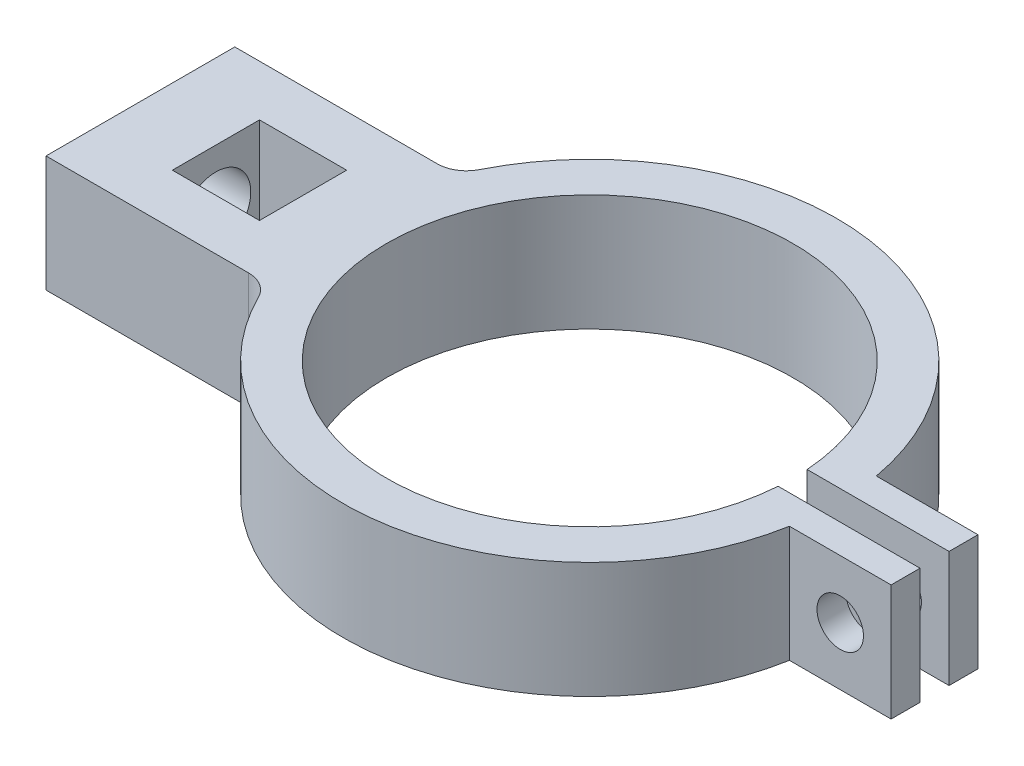
ISO-10303-21;
HEADER;
FILE_DESCRIPTION(('STEP AP214'),'2;1');
FILE_NAME('part.step','',(''),(''),'','','');
FILE_SCHEMA(('AUTOMOTIVE_DESIGN { 1 0 10303 214 1 1 1 1 }'));
ENDSEC;
DATA;
#1=APPLICATION_CONTEXT('core data for automotive mechanical design processes');
#2=APPLICATION_PROTOCOL_DEFINITION('international standard','automotive_design',2000,#1);
#3=PRODUCT_CONTEXT('',#1,'mechanical');
#4=PRODUCT('Part','Part','',(#3));
#5=PRODUCT_RELATED_PRODUCT_CATEGORY('part','',(#4));
#6=PRODUCT_DEFINITION_FORMATION('','',#4);
#7=PRODUCT_DEFINITION_CONTEXT('part definition',#1,'design');
#8=PRODUCT_DEFINITION('design','',#6,#7);
#9=PRODUCT_DEFINITION_SHAPE('','',#8);
#10=(LENGTH_UNIT() NAMED_UNIT(*) SI_UNIT(.MILLI.,.METRE.));
#11=(NAMED_UNIT(*) PLANE_ANGLE_UNIT() SI_UNIT($,.RADIAN.));
#12=(NAMED_UNIT(*) SI_UNIT($,.STERADIAN.) SOLID_ANGLE_UNIT());
#13=UNCERTAINTY_MEASURE_WITH_UNIT(LENGTH_MEASURE(1.E-05),#10,'distance_accuracy_value','');
#14=(GEOMETRIC_REPRESENTATION_CONTEXT(3) GLOBAL_UNCERTAINTY_ASSIGNED_CONTEXT((#13)) GLOBAL_UNIT_ASSIGNED_CONTEXT((#10,
#11,#12)) REPRESENTATION_CONTEXT('',''));
#15=CARTESIAN_POINT('',(0.,0.,0.));
#16=DIRECTION('',(0.,0.,1.));
#17=DIRECTION('',(1.,0.,0.));
#18=AXIS2_PLACEMENT_3D('',#15,#16,#17);
#19=CARTESIAN_POINT('',(0.,10.16,0.));
#20=DIRECTION('',(0.,1.,0.));
#21=DIRECTION('',(0.,0.,1.));
#22=AXIS2_PLACEMENT_3D('',#19,#20,#21);
#23=PLANE('',#22);
#24=CARTESIAN_POINT('',(0.,10.16,0.));
#25=DIRECTION('',(0.,1.,0.));
#26=DIRECTION('',(0.,0.,1.));
#27=AXIS2_PLACEMENT_3D('',#24,#25,#26);
#28=CIRCLE('',#27,21.59);
#29=CARTESIAN_POINT('',(21.251230572981,10.16,-3.8096324145508));
#30=VERTEX_POINT('',#29);
#31=CARTESIAN_POINT('',(-19.3090113501787,10.16,-9.65868421052631));
#32=VERTEX_POINT('',#31);
#33=EDGE_CURVE('E227',#30,#32,#28,.T.);
#34=ORIENTED_EDGE('',*,*,#33,.T.);
#35=CARTESIAN_POINT('',(-21.5806597443174,10.16,-10.795));
#36=DIRECTION('',(0.,1.,0.));
#37=DIRECTION('',(0.,0.,1.));
#38=AXIS2_PLACEMENT_3D('',#35,#36,#37);
#39=CIRCLE('',#38,2.54);
#40=CARTESIAN_POINT('',(-21.5806597443174,10.16,-8.255));
#41=VERTEX_POINT('',#40);
#42=EDGE_CURVE('E294',#32,#41,#39,.F.);
#43=ORIENTED_EDGE('',*,*,#42,.T.);
#44=DIRECTION('',(-1.,0.,0.));
#45=VECTOR('',#44,1.);
#46=CARTESIAN_POINT('',(-19.9495131519544,10.16,-8.255));
#47=LINE('',#46,#45);
#48=CARTESIAN_POINT('',(-39.2920360483371,10.16,-8.255));
#49=VERTEX_POINT('',#48);
#50=EDGE_CURVE('E204',#41,#49,#47,.T.);
#51=ORIENTED_EDGE('',*,*,#50,.T.);
#52=DIRECTION('',(0.,0.,1.));
#53=VECTOR('',#52,1.);
#54=CARTESIAN_POINT('',(-39.2920360483371,10.16,-8.255));
#55=LINE('',#54,#53);
#56=CARTESIAN_POINT('',(-39.2920360483371,10.16,8.255));
#57=VERTEX_POINT('',#56);
#58=EDGE_CURVE('E206',#49,#57,#55,.T.);
#59=ORIENTED_EDGE('',*,*,#58,.T.);
#60=DIRECTION('',(1.,0.,0.));
#61=VECTOR('',#60,1.);
#62=CARTESIAN_POINT('',(-19.9495131519544,10.16,8.255));
#63=LINE('',#62,#61);
#64=CARTESIAN_POINT('',(-21.5806597443174,10.16,8.255));
#65=VERTEX_POINT('',#64);
#66=EDGE_CURVE('E209',#57,#65,#63,.T.);
#67=ORIENTED_EDGE('',*,*,#66,.T.);
#68=CARTESIAN_POINT('',(-21.5806597443174,10.16,10.795));
#69=DIRECTION('',(0.,1.,0.));
#70=DIRECTION('',(0.,0.,1.));
#71=AXIS2_PLACEMENT_3D('',#68,#69,#70);
#72=CIRCLE('',#71,2.54);
#73=CARTESIAN_POINT('',(-19.3090113501787,10.16,9.65868421052632));
#74=VERTEX_POINT('',#73);
#75=EDGE_CURVE('E11',#65,#74,#72,.F.);
#76=ORIENTED_EDGE('',*,*,#75,.T.);
#77=CARTESIAN_POINT('',(0.,10.16,0.));
#78=DIRECTION('',(0.,1.,0.));
#79=DIRECTION('',(0.,0.,1.));
#80=AXIS2_PLACEMENT_3D('',#77,#78,#79);
#81=CIRCLE('',#80,21.59);
#82=CARTESIAN_POINT('',(21.254338077432,10.16,3.79225696521527));
#83=VERTEX_POINT('',#82);
#84=EDGE_CURVE('E211',#74,#83,#81,.T.);
#85=ORIENTED_EDGE('',*,*,#84,.T.);
#86=DIRECTION('',(1.,0.,0.));
#87=VECTOR('',#86,1.);
#88=CARTESIAN_POINT('',(21.254338077432,10.16,3.79225696521527));
#89=LINE('',#88,#87);
#90=CARTESIAN_POINT('',(30.144338077432,10.16,3.79225696521527));
#91=VERTEX_POINT('',#90);
#92=EDGE_CURVE('E213',#83,#91,#89,.T.);
#93=ORIENTED_EDGE('',*,*,#92,.T.);
#94=DIRECTION('',(0.,0.,-1.));
#95=VECTOR('',#94,1.);
#96=CARTESIAN_POINT('',(30.144338077432,10.16,1.26131107947048));
#97=LINE('',#96,#95);
#98=CARTESIAN_POINT('',(30.144338077432,10.16,1.26131107947048));
#99=VERTEX_POINT('',#98);
#100=EDGE_CURVE('E215',#91,#99,#97,.T.);
#101=ORIENTED_EDGE('',*,*,#100,.T.);
#102=DIRECTION('',(-1.,0.,0.));
#103=VECTOR('',#102,1.);
#104=CARTESIAN_POINT('',(30.144338077432,10.16,1.26131107947048));
#105=LINE('',#104,#103);
#106=CARTESIAN_POINT('',(17.7327902966092,10.16,1.26131107947048));
#107=VERTEX_POINT('',#106);
#108=EDGE_CURVE('E217',#99,#107,#105,.T.);
#109=ORIENTED_EDGE('',*,*,#108,.T.);
#110=CARTESIAN_POINT('',(0.,10.16,0.));
#111=DIRECTION('',(0.,-1.,0.));
#112=DIRECTION('',(0.,0.,1.));
#113=AXIS2_PLACEMENT_3D('',#110,#111,#112);
#114=CIRCLE('',#113,17.7775914381761);
#115=CARTESIAN_POINT('',(17.7315458464219,10.16,-1.27868652880601));
#116=VERTEX_POINT('',#115);
#117=EDGE_CURVE('E219',#107,#116,#114,.T.);
#118=ORIENTED_EDGE('',*,*,#117,.T.);
#119=DIRECTION('',(1.,0.,0.));
#120=VECTOR('',#119,1.);
#121=CARTESIAN_POINT('',(30.141230572981,10.16,-1.27868652880601));
#122=LINE('',#121,#120);
#123=CARTESIAN_POINT('',(30.141230572981,10.16,-1.27868652880601));
#124=VERTEX_POINT('',#123);
#125=EDGE_CURVE('E221',#116,#124,#122,.T.);
#126=ORIENTED_EDGE('',*,*,#125,.T.);
#127=DIRECTION('',(0.,0.,-1.));
#128=VECTOR('',#127,1.);
#129=CARTESIAN_POINT('',(30.141230572981,10.16,-3.8096324145508));
#130=LINE('',#129,#128);
#131=CARTESIAN_POINT('',(30.141230572981,10.16,-3.8096324145508));
#132=VERTEX_POINT('',#131);
#133=EDGE_CURVE('E223',#124,#132,#130,.T.);
#134=ORIENTED_EDGE('',*,*,#133,.T.);
#135=DIRECTION('',(-1.,0.,0.));
#136=VECTOR('',#135,1.);
#137=CARTESIAN_POINT('',(21.251230572981,10.16,-3.8096324145508));
#138=LINE('',#137,#136);
#139=EDGE_CURVE('E225',#132,#30,#138,.T.);
#140=ORIENTED_EDGE('',*,*,#139,.T.);
#141=EDGE_LOOP('',(#34,#43,#51,#59,#67,#76,#85,#93,#101,#109,#118,#126,#134,#140));
#142=FACE_BOUND('',#141,.T.);
#143=DIRECTION('',(-1.,0.,0.));
#144=VECTOR('',#143,1.);
#145=CARTESIAN_POINT('',(-32.6880360483371,10.16,-3.8096324145508));
#146=LINE('',#145,#144);
#147=CARTESIAN_POINT('',(-25.0680360483371,10.16,-3.8096324145508));
#148=VERTEX_POINT('',#147);
#149=CARTESIAN_POINT('',(-32.6880360483371,10.16,-3.8096324145508));
#150=VERTEX_POINT('',#149);
#151=EDGE_CURVE('E171',#148,#150,#146,.T.);
#152=ORIENTED_EDGE('',*,*,#151,.F.);
#153=DIRECTION('',(0.,0.,-1.));
#154=VECTOR('',#153,1.);
#155=CARTESIAN_POINT('',(-25.0680360483371,10.16,3.81036758544919));
#156=LINE('',#155,#154);
#157=CARTESIAN_POINT('',(-25.0680360483371,10.16,3.81036758544919));
#158=VERTEX_POINT('',#157);
#159=EDGE_CURVE('E161',#158,#148,#156,.T.);
#160=ORIENTED_EDGE('',*,*,#159,.F.);
#161=DIRECTION('',(1.,0.,0.));
#162=VECTOR('',#161,1.);
#163=CARTESIAN_POINT('',(-32.6880360483371,10.16,3.81036758544919));
#164=LINE('',#163,#162);
#165=CARTESIAN_POINT('',(-32.6880360483371,10.16,3.81036758544919));
#166=VERTEX_POINT('',#165);
#167=EDGE_CURVE('E186',#166,#158,#164,.T.);
#168=ORIENTED_EDGE('',*,*,#167,.F.);
#169=DIRECTION('',(0.,0.,1.));
#170=VECTOR('',#169,1.);
#171=CARTESIAN_POINT('',(-32.6880360483371,10.16,3.81036758544919));
#172=LINE('',#171,#170);
#173=EDGE_CURVE('E184',#150,#166,#172,.T.);
#174=ORIENTED_EDGE('',*,*,#173,.F.);
#175=EDGE_LOOP('',(#152,#160,#168,#174));
#176=FACE_BOUND('',#175,.T.);
#177=ADVANCED_FACE('F35',(#142,#176),#23,.T.);
#178=CARTESIAN_POINT('',(0.,0.,0.));
#179=DIRECTION('',(0.,1.,0.));
#180=DIRECTION('',(0.,0.,1.));
#181=AXIS2_PLACEMENT_3D('',#178,#179,#180);
#182=PLANE('',#181);
#183=DIRECTION('',(-1.,0.,0.));
#184=VECTOR('',#183,1.);
#185=CARTESIAN_POINT('',(-19.9495131519544,0.,-8.255));
#186=LINE('',#185,#184);
#187=CARTESIAN_POINT('',(-21.5806597443174,0.,-8.255));
#188=VERTEX_POINT('',#187);
#189=CARTESIAN_POINT('',(-39.2920360483371,0.,-8.255));
#190=VERTEX_POINT('',#189);
#191=EDGE_CURVE('E179',#188,#190,#186,.T.);
#192=ORIENTED_EDGE('',*,*,#191,.F.);
#193=CARTESIAN_POINT('',(-21.5806597443174,0.,-10.795));
#194=DIRECTION('',(0.,1.,0.));
#195=DIRECTION('',(0.,0.,1.));
#196=AXIS2_PLACEMENT_3D('',#193,#194,#195);
#197=CIRCLE('',#196,2.54);
#198=CARTESIAN_POINT('',(-19.3090113501787,0.,-9.65868421052631));
#199=VERTEX_POINT('',#198);
#200=EDGE_CURVE('E292',#188,#199,#197,.T.);
#201=ORIENTED_EDGE('',*,*,#200,.T.);
#202=CARTESIAN_POINT('',(0.,0.,0.));
#203=DIRECTION('',(0.,1.,0.));
#204=DIRECTION('',(0.,0.,1.));
#205=AXIS2_PLACEMENT_3D('',#202,#203,#204);
#206=CIRCLE('',#205,21.59);
#207=CARTESIAN_POINT('',(21.251230572981,0.,-3.8096324145508));
#208=VERTEX_POINT('',#207);
#209=EDGE_CURVE('E207',#208,#199,#206,.T.);
#210=ORIENTED_EDGE('',*,*,#209,.F.);
#211=DIRECTION('',(-1.,0.,0.));
#212=VECTOR('',#211,1.);
#213=CARTESIAN_POINT('',(21.251230572981,0.,-3.8096324145508));
#214=LINE('',#213,#212);
#215=CARTESIAN_POINT('',(30.141230572981,0.,-3.8096324145508));
#216=VERTEX_POINT('',#215);
#217=EDGE_CURVE('E250',#216,#208,#214,.T.);
#218=ORIENTED_EDGE('',*,*,#217,.F.);
#219=DIRECTION('',(0.,0.,-1.));
#220=VECTOR('',#219,1.);
#221=CARTESIAN_POINT('',(30.141230572981,0.,-3.8096324145508));
#222=LINE('',#221,#220);
#223=CARTESIAN_POINT('',(30.141230572981,0.,-1.27868652880601));
#224=VERTEX_POINT('',#223);
#225=EDGE_CURVE('E248',#224,#216,#222,.T.);
#226=ORIENTED_EDGE('',*,*,#225,.F.);
#227=DIRECTION('',(1.,0.,0.));
#228=VECTOR('',#227,1.);
#229=CARTESIAN_POINT('',(30.141230572981,0.,-1.27868652880601));
#230=LINE('',#229,#228);
#231=CARTESIAN_POINT('',(17.7315458464219,0.,-1.27868652880601));
#232=VERTEX_POINT('',#231);
#233=EDGE_CURVE('E246',#232,#224,#230,.T.);
#234=ORIENTED_EDGE('',*,*,#233,.F.);
#235=CARTESIAN_POINT('',(0.,0.,0.));
#236=DIRECTION('',(0.,-1.,0.));
#237=DIRECTION('',(0.,0.,1.));
#238=AXIS2_PLACEMENT_3D('',#235,#236,#237);
#239=CIRCLE('',#238,17.7775914381761);
#240=CARTESIAN_POINT('',(17.7327902966092,0.,1.26131107947048));
#241=VERTEX_POINT('',#240);
#242=EDGE_CURVE('E244',#241,#232,#239,.T.);
#243=ORIENTED_EDGE('',*,*,#242,.F.);
#244=DIRECTION('',(-1.,0.,0.));
#245=VECTOR('',#244,1.);
#246=CARTESIAN_POINT('',(30.144338077432,0.,1.26131107947048));
#247=LINE('',#246,#245);
#248=CARTESIAN_POINT('',(30.144338077432,0.,1.26131107947048));
#249=VERTEX_POINT('',#248);
#250=EDGE_CURVE('E242',#249,#241,#247,.T.);
#251=ORIENTED_EDGE('',*,*,#250,.F.);
#252=DIRECTION('',(0.,0.,-1.));
#253=VECTOR('',#252,1.);
#254=CARTESIAN_POINT('',(30.144338077432,0.,1.26131107947048));
#255=LINE('',#254,#253);
#256=CARTESIAN_POINT('',(30.144338077432,0.,3.79225696521527));
#257=VERTEX_POINT('',#256);
#258=EDGE_CURVE('E240',#257,#249,#255,.T.);
#259=ORIENTED_EDGE('',*,*,#258,.F.);
#260=DIRECTION('',(1.,0.,0.));
#261=VECTOR('',#260,1.);
#262=CARTESIAN_POINT('',(21.254338077432,0.,3.79225696521527));
#263=LINE('',#262,#261);
#264=CARTESIAN_POINT('',(21.254338077432,0.,3.79225696521527));
#265=VERTEX_POINT('',#264);
#266=EDGE_CURVE('E238',#265,#257,#263,.T.);
#267=ORIENTED_EDGE('',*,*,#266,.F.);
#268=CARTESIAN_POINT('',(0.,0.,0.));
#269=DIRECTION('',(0.,1.,0.));
#270=DIRECTION('',(0.,0.,1.));
#271=AXIS2_PLACEMENT_3D('',#268,#269,#270);
#272=CIRCLE('',#271,21.59);
#273=CARTESIAN_POINT('',(-19.3090113501787,0.,9.65868421052632));
#274=VERTEX_POINT('',#273);
#275=EDGE_CURVE('E236',#274,#265,#272,.T.);
#276=ORIENTED_EDGE('',*,*,#275,.F.);
#277=CARTESIAN_POINT('',(-21.5806597443174,0.,10.795));
#278=DIRECTION('',(0.,1.,0.));
#279=DIRECTION('',(0.,0.,1.));
#280=AXIS2_PLACEMENT_3D('',#277,#278,#279);
#281=CIRCLE('',#280,2.54);
#282=CARTESIAN_POINT('',(-21.5806597443174,0.,8.255));
#283=VERTEX_POINT('',#282);
#284=EDGE_CURVE('E43',#274,#283,#281,.T.);
#285=ORIENTED_EDGE('',*,*,#284,.T.);
#286=DIRECTION('',(1.,0.,0.));
#287=VECTOR('',#286,1.);
#288=CARTESIAN_POINT('',(-19.9495131519544,0.,8.255));
#289=LINE('',#288,#287);
#290=CARTESIAN_POINT('',(-39.2920360483371,0.,8.255));
#291=VERTEX_POINT('',#290);
#292=EDGE_CURVE('E234',#291,#283,#289,.T.);
#293=ORIENTED_EDGE('',*,*,#292,.F.);
#294=DIRECTION('',(0.,0.,1.));
#295=VECTOR('',#294,1.);
#296=CARTESIAN_POINT('',(-39.2920360483371,0.,-8.255));
#297=LINE('',#296,#295);
#298=EDGE_CURVE('E232',#190,#291,#297,.T.);
#299=ORIENTED_EDGE('',*,*,#298,.F.);
#300=EDGE_LOOP('',(#192,#201,#210,#218,#226,#234,#243,#251,#259,#267,#276,#285,#293,#299));
#301=FACE_BOUND('',#300,.T.);
#302=DIRECTION('',(0.,0.,-1.));
#303=VECTOR('',#302,1.);
#304=CARTESIAN_POINT('',(-25.0680360483371,0.,3.81036758544919));
#305=LINE('',#304,#303);
#306=CARTESIAN_POINT('',(-25.0680360483371,0.,3.81036758544919));
#307=VERTEX_POINT('',#306);
#308=CARTESIAN_POINT('',(-25.0680360483371,0.,-3.8096324145508));
#309=VERTEX_POINT('',#308);
#310=EDGE_CURVE('E191',#307,#309,#305,.T.);
#311=ORIENTED_EDGE('',*,*,#310,.T.);
#312=DIRECTION('',(-1.,0.,0.));
#313=VECTOR('',#312,1.);
#314=CARTESIAN_POINT('',(-32.6880360483371,0.,-3.8096324145508));
#315=LINE('',#314,#313);
#316=CARTESIAN_POINT('',(-32.6880360483371,0.,-3.8096324145508));
#317=VERTEX_POINT('',#316);
#318=EDGE_CURVE('E178',#309,#317,#315,.T.);
#319=ORIENTED_EDGE('',*,*,#318,.T.);
#320=DIRECTION('',(0.,0.,1.));
#321=VECTOR('',#320,1.);
#322=CARTESIAN_POINT('',(-32.6880360483371,0.,3.81036758544919));
#323=LINE('',#322,#321);
#324=CARTESIAN_POINT('',(-32.6880360483371,0.,3.81036758544919));
#325=VERTEX_POINT('',#324);
#326=EDGE_CURVE('E195',#317,#325,#323,.T.);
#327=ORIENTED_EDGE('',*,*,#326,.T.);
#328=DIRECTION('',(1.,0.,0.));
#329=VECTOR('',#328,1.);
#330=CARTESIAN_POINT('',(-32.6880360483371,0.,3.81036758544919));
#331=LINE('',#330,#329);
#332=EDGE_CURVE('E172',#325,#307,#331,.T.);
#333=ORIENTED_EDGE('',*,*,#332,.T.);
#334=EDGE_LOOP('',(#311,#319,#327,#333));
#335=FACE_BOUND('',#334,.T.);
#336=ADVANCED_FACE('F309',(#301,#335),#182,.F.);
#337=CARTESIAN_POINT('',(-19.9495131519544,10.16,-8.255));
#338=DIRECTION('',(0.,0.,1.));
#339=DIRECTION('',(1.,0.,0.));
#340=AXIS2_PLACEMENT_3D('',#337,#338,#339);
#341=PLANE('',#340);
#342=ORIENTED_EDGE('',*,*,#50,.F.);
#343=DIRECTION('',(0.,1.,0.));
#344=VECTOR('',#343,1.);
#345=CARTESIAN_POINT('',(-21.5806597443174,0.,-8.255));
#346=LINE('',#345,#344);
#347=EDGE_CURVE('E283',#41,#188,#346,.F.);
#348=ORIENTED_EDGE('',*,*,#347,.T.);
#349=ORIENTED_EDGE('',*,*,#191,.T.);
#350=DIRECTION('',(0.,-1.,0.));
#351=VECTOR('',#350,1.);
#352=CARTESIAN_POINT('',(-39.2920360483371,10.16,-8.255));
#353=LINE('',#352,#351);
#354=EDGE_CURVE('E280',#49,#190,#353,.T.);
#355=ORIENTED_EDGE('',*,*,#354,.F.);
#356=EDGE_LOOP('',(#342,#348,#349,#355));
#357=FACE_BOUND('',#356,.T.);
#358=ADVANCED_FACE('F305',(#357),#341,.F.);
#359=CARTESIAN_POINT('',(-39.2920360483371,10.16,-8.255));
#360=DIRECTION('',(1.,0.,0.));
#361=DIRECTION('',(0.,0.,-1.));
#362=AXIS2_PLACEMENT_3D('',#359,#360,#361);
#363=PLANE('',#362);
#364=CARTESIAN_POINT('',(-39.2920360483371,5.08,0.));
#365=DIRECTION('',(-1.,0.,0.));
#366=DIRECTION('',(0.,0.,1.));
#367=AXIS2_PLACEMENT_3D('',#364,#365,#366);
#368=CIRCLE('',#367,3.048);
#369=CARTESIAN_POINT('',(-39.2920360483371,5.08,3.048));
#370=VERTEX_POINT('',#369);
#371=EDGE_CURVE('E559',#370,#370,#368,.T.);
#372=ORIENTED_EDGE('',*,*,#371,.F.);
#373=EDGE_LOOP('',(#372));
#374=FACE_BOUND('',#373,.T.);
#375=ORIENTED_EDGE('',*,*,#298,.T.);
#376=DIRECTION('',(0.,-1.,0.));
#377=VECTOR('',#376,1.);
#378=CARTESIAN_POINT('',(-39.2920360483371,10.16,8.255));
#379=LINE('',#378,#377);
#380=EDGE_CURVE('E277',#57,#291,#379,.T.);
#381=ORIENTED_EDGE('',*,*,#380,.F.);
#382=ORIENTED_EDGE('',*,*,#58,.F.);
#383=ORIENTED_EDGE('',*,*,#354,.T.);
#384=EDGE_LOOP('',(#375,#381,#382,#383));
#385=FACE_BOUND('',#384,.T.);
#386=ADVANCED_FACE('F359',(#374,#385),#363,.F.);
#387=CARTESIAN_POINT('',(-19.9495131519544,10.16,8.255));
#388=DIRECTION('',(0.,0.,-1.));
#389=DIRECTION('',(-1.,0.,0.));
#390=AXIS2_PLACEMENT_3D('',#387,#388,#389);
#391=PLANE('',#390);
#392=ORIENTED_EDGE('',*,*,#292,.T.);
#393=DIRECTION('',(0.,1.,0.));
#394=VECTOR('',#393,1.);
#395=CARTESIAN_POINT('',(-21.5806597443174,10.16,8.255));
#396=LINE('',#395,#394);
#397=EDGE_CURVE('E50',#283,#65,#396,.T.);
#398=ORIENTED_EDGE('',*,*,#397,.T.);
#399=ORIENTED_EDGE('',*,*,#66,.F.);
#400=ORIENTED_EDGE('',*,*,#380,.T.);
#401=EDGE_LOOP('',(#392,#398,#399,#400));
#402=FACE_BOUND('',#401,.T.);
#403=ADVANCED_FACE('F357',(#402),#391,.F.);
#404=CARTESIAN_POINT('',(0.,10.16,0.));
#405=DIRECTION('',(0.,-1.,0.));
#406=DIRECTION('',(0.,0.,-1.));
#407=AXIS2_PLACEMENT_3D('',#404,#405,#406);
#408=CYLINDRICAL_SURFACE('',#407,21.59);
#409=ORIENTED_EDGE('',*,*,#84,.F.);
#410=DIRECTION('',(0.,-1.,0.));
#411=VECTOR('',#410,1.);
#412=CARTESIAN_POINT('',(-19.3090113501787,10.16,9.65868421052632));
#413=LINE('',#412,#411);
#414=EDGE_CURVE('E288',#74,#274,#413,.T.);
#415=ORIENTED_EDGE('',*,*,#414,.T.);
#416=ORIENTED_EDGE('',*,*,#275,.T.);
#417=DIRECTION('',(0.,-1.,0.));
#418=VECTOR('',#417,1.);
#419=CARTESIAN_POINT('',(21.254338077432,10.16,3.79225696521527));
#420=LINE('',#419,#418);
#421=EDGE_CURVE('E274',#83,#265,#420,.T.);
#422=ORIENTED_EDGE('',*,*,#421,.F.);
#423=EDGE_LOOP('',(#409,#415,#416,#422));
#424=FACE_BOUND('',#423,.T.);
#425=ADVANCED_FACE('F352',(#424),#408,.T.);
#426=CARTESIAN_POINT('',(21.254338077432,10.16,3.79225696521527));
#427=DIRECTION('',(0.,0.,-1.));
#428=DIRECTION('',(-1.,0.,0.));
#429=AXIS2_PLACEMENT_3D('',#426,#427,#428);
#430=PLANE('',#429);
#431=CARTESIAN_POINT('',(25.696230572981,5.08,3.79225696521527));
#432=DIRECTION('',(0.,0.,-1.));
#433=DIRECTION('',(-1.,0.,0.));
#434=AXIS2_PLACEMENT_3D('',#431,#432,#433);
#435=CIRCLE('',#434,2.032);
#436=CARTESIAN_POINT('',(23.664230572981,5.08,3.79225696521527));
#437=VERTEX_POINT('',#436);
#438=EDGE_CURVE('E566',#437,#437,#435,.F.);
#439=ORIENTED_EDGE('',*,*,#438,.F.);
#440=EDGE_LOOP('',(#439));
#441=FACE_BOUND('',#440,.T.);
#442=ORIENTED_EDGE('',*,*,#266,.T.);
#443=DIRECTION('',(0.,-1.,0.));
#444=VECTOR('',#443,1.);
#445=CARTESIAN_POINT('',(30.144338077432,10.16,3.79225696521527));
#446=LINE('',#445,#444);
#447=EDGE_CURVE('E271',#91,#257,#446,.T.);
#448=ORIENTED_EDGE('',*,*,#447,.F.);
#449=ORIENTED_EDGE('',*,*,#92,.F.);
#450=ORIENTED_EDGE('',*,*,#421,.T.);
#451=EDGE_LOOP('',(#442,#448,#449,#450));
#452=FACE_BOUND('',#451,.T.);
#453=ADVANCED_FACE('F348',(#441,#452),#430,.F.);
#454=CARTESIAN_POINT('',(30.144338077432,10.16,1.26131107947048));
#455=DIRECTION('',(-1.,0.,0.));
#456=DIRECTION('',(0.,0.,1.));
#457=AXIS2_PLACEMENT_3D('',#454,#455,#456);
#458=PLANE('',#457);
#459=ORIENTED_EDGE('',*,*,#258,.T.);
#460=DIRECTION('',(0.,-1.,0.));
#461=VECTOR('',#460,1.);
#462=CARTESIAN_POINT('',(30.144338077432,10.16,1.26131107947048));
#463=LINE('',#462,#461);
#464=EDGE_CURVE('E268',#99,#249,#463,.T.);
#465=ORIENTED_EDGE('',*,*,#464,.F.);
#466=ORIENTED_EDGE('',*,*,#100,.F.);
#467=ORIENTED_EDGE('',*,*,#447,.T.);
#468=EDGE_LOOP('',(#459,#465,#466,#467));
#469=FACE_BOUND('',#468,.T.);
#470=ADVANCED_FACE('F344',(#469),#458,.F.);
#471=CARTESIAN_POINT('',(30.144338077432,10.16,1.26131107947048));
#472=DIRECTION('',(0.,0.,1.));
#473=DIRECTION('',(1.,0.,0.));
#474=AXIS2_PLACEMENT_3D('',#471,#472,#473);
#475=PLANE('',#474);
#476=CARTESIAN_POINT('',(25.696230572981,5.08,1.26131107947048));
#477=DIRECTION('',(0.,0.,1.));
#478=DIRECTION('',(1.,0.,0.));
#479=AXIS2_PLACEMENT_3D('',#476,#477,#478);
#480=CIRCLE('',#479,2.032);
#481=CARTESIAN_POINT('',(27.728230572981,5.08,1.26131107947048));
#482=VERTEX_POINT('',#481);
#483=EDGE_CURVE('E193',#482,#482,#480,.T.);
#484=ORIENTED_EDGE('',*,*,#483,.T.);
#485=EDGE_LOOP('',(#484));
#486=FACE_BOUND('',#485,.T.);
#487=ORIENTED_EDGE('',*,*,#250,.T.);
#488=DIRECTION('',(0.,-1.,0.));
#489=VECTOR('',#488,1.);
#490=CARTESIAN_POINT('',(17.7327902966092,10.16,1.26131107947048));
#491=LINE('',#490,#489);
#492=EDGE_CURVE('E265',#107,#241,#491,.T.);
#493=ORIENTED_EDGE('',*,*,#492,.F.);
#494=ORIENTED_EDGE('',*,*,#108,.F.);
#495=ORIENTED_EDGE('',*,*,#464,.T.);
#496=EDGE_LOOP('',(#487,#493,#494,#495));
#497=FACE_BOUND('',#496,.T.);
#498=ADVANCED_FACE('F339',(#486,#497),#475,.F.);
#499=CARTESIAN_POINT('',(0.,10.16,0.));
#500=DIRECTION('',(0.,-1.,0.));
#501=DIRECTION('',(0.,0.,-1.));
#502=AXIS2_PLACEMENT_3D('',#499,#500,#501);
#503=CYLINDRICAL_SURFACE('',#502,17.7775914381761);
#504=ORIENTED_EDGE('',*,*,#242,.T.);
#505=DIRECTION('',(0.,-1.,0.));
#506=VECTOR('',#505,1.);
#507=CARTESIAN_POINT('',(17.7315458464219,10.16,-1.27868652880601));
#508=LINE('',#507,#506);
#509=EDGE_CURVE('E262',#116,#232,#508,.T.);
#510=ORIENTED_EDGE('',*,*,#509,.F.);
#511=ORIENTED_EDGE('',*,*,#117,.F.);
#512=ORIENTED_EDGE('',*,*,#492,.T.);
#513=EDGE_LOOP('',(#504,#510,#511,#512));
#514=FACE_BOUND('',#513,.T.);
#515=ADVANCED_FACE('F333',(#514),#503,.F.);
#516=CARTESIAN_POINT('',(30.141230572981,10.16,-1.27868652880601));
#517=DIRECTION('',(0.,0.,-1.));
#518=DIRECTION('',(-1.,0.,0.));
#519=AXIS2_PLACEMENT_3D('',#516,#517,#518);
#520=PLANE('',#519);
#521=CARTESIAN_POINT('',(25.696230572981,5.08,-1.27868652880601));
#522=DIRECTION('',(0.,0.,-1.));
#523=DIRECTION('',(-1.,0.,0.));
#524=AXIS2_PLACEMENT_3D('',#521,#522,#523);
#525=CIRCLE('',#524,2.032);
#526=CARTESIAN_POINT('',(23.664230572981,5.08,-1.27868652880601));
#527=VERTEX_POINT('',#526);
#528=EDGE_CURVE('E572',#527,#527,#525,.T.);
#529=ORIENTED_EDGE('',*,*,#528,.T.);
#530=EDGE_LOOP('',(#529));
#531=FACE_BOUND('',#530,.T.);
#532=ORIENTED_EDGE('',*,*,#233,.T.);
#533=DIRECTION('',(0.,-1.,0.));
#534=VECTOR('',#533,1.);
#535=CARTESIAN_POINT('',(30.141230572981,10.16,-1.27868652880601));
#536=LINE('',#535,#534);
#537=EDGE_CURVE('E259',#124,#224,#536,.T.);
#538=ORIENTED_EDGE('',*,*,#537,.F.);
#539=ORIENTED_EDGE('',*,*,#125,.F.);
#540=ORIENTED_EDGE('',*,*,#509,.T.);
#541=EDGE_LOOP('',(#532,#538,#539,#540));
#542=FACE_BOUND('',#541,.T.);
#543=ADVANCED_FACE('F329',(#531,#542),#520,.F.);
#544=CARTESIAN_POINT('',(30.141230572981,10.16,-3.8096324145508));
#545=DIRECTION('',(-1.,0.,0.));
#546=DIRECTION('',(0.,0.,1.));
#547=AXIS2_PLACEMENT_3D('',#544,#545,#546);
#548=PLANE('',#547);
#549=ORIENTED_EDGE('',*,*,#225,.T.);
#550=DIRECTION('',(0.,-1.,0.));
#551=VECTOR('',#550,1.);
#552=CARTESIAN_POINT('',(30.141230572981,10.16,-3.8096324145508));
#553=LINE('',#552,#551);
#554=EDGE_CURVE('E256',#132,#216,#553,.T.);
#555=ORIENTED_EDGE('',*,*,#554,.F.);
#556=ORIENTED_EDGE('',*,*,#133,.F.);
#557=ORIENTED_EDGE('',*,*,#537,.T.);
#558=EDGE_LOOP('',(#549,#555,#556,#557));
#559=FACE_BOUND('',#558,.T.);
#560=ADVANCED_FACE('F324',(#559),#548,.F.);
#561=CARTESIAN_POINT('',(21.251230572981,10.16,-3.8096324145508));
#562=DIRECTION('',(0.,0.,1.));
#563=DIRECTION('',(1.,0.,0.));
#564=AXIS2_PLACEMENT_3D('',#561,#562,#563);
#565=PLANE('',#564);
#566=CARTESIAN_POINT('',(25.696230572981,5.08,-3.8096324145508));
#567=DIRECTION('',(0.,0.,-1.));
#568=DIRECTION('',(-1.,0.,0.));
#569=AXIS2_PLACEMENT_3D('',#566,#567,#568);
#570=CIRCLE('',#569,2.032);
#571=CARTESIAN_POINT('',(23.664230572981,5.08,-3.8096324145508));
#572=VERTEX_POINT('',#571);
#573=EDGE_CURVE('E563',#572,#572,#570,.T.);
#574=ORIENTED_EDGE('',*,*,#573,.F.);
#575=EDGE_LOOP('',(#574));
#576=FACE_BOUND('',#575,.T.);
#577=ORIENTED_EDGE('',*,*,#217,.T.);
#578=DIRECTION('',(0.,-1.,0.));
#579=VECTOR('',#578,1.);
#580=CARTESIAN_POINT('',(21.251230572981,10.16,-3.8096324145508));
#581=LINE('',#580,#579);
#582=EDGE_CURVE('E230',#30,#208,#581,.T.);
#583=ORIENTED_EDGE('',*,*,#582,.F.);
#584=ORIENTED_EDGE('',*,*,#139,.F.);
#585=ORIENTED_EDGE('',*,*,#554,.T.);
#586=EDGE_LOOP('',(#577,#583,#584,#585));
#587=FACE_BOUND('',#586,.T.);
#588=ADVANCED_FACE('F318',(#576,#587),#565,.F.);
#589=CARTESIAN_POINT('',(0.,10.16,0.));
#590=DIRECTION('',(0.,-1.,0.));
#591=DIRECTION('',(0.,0.,-1.));
#592=AXIS2_PLACEMENT_3D('',#589,#590,#591);
#593=CYLINDRICAL_SURFACE('',#592,21.59);
#594=ORIENTED_EDGE('',*,*,#209,.T.);
#595=DIRECTION('',(0.,-1.,0.));
#596=VECTOR('',#595,1.);
#597=CARTESIAN_POINT('',(-19.3090113501787,10.16,-9.65868421052632));
#598=LINE('',#597,#596);
#599=EDGE_CURVE('E286',#199,#32,#598,.F.);
#600=ORIENTED_EDGE('',*,*,#599,.T.);
#601=ORIENTED_EDGE('',*,*,#33,.F.);
#602=ORIENTED_EDGE('',*,*,#582,.T.);
#603=EDGE_LOOP('',(#594,#600,#601,#602));
#604=FACE_BOUND('',#603,.T.);
#605=ADVANCED_FACE('F314',(#604),#593,.T.);
#606=CARTESIAN_POINT('',(-25.0680360483371,10.16,3.81036758544919));
#607=DIRECTION('',(-1.,0.,0.));
#608=DIRECTION('',(0.,0.,1.));
#609=AXIS2_PLACEMENT_3D('',#606,#607,#608);
#610=PLANE('',#609);
#611=ORIENTED_EDGE('',*,*,#310,.F.);
#612=DIRECTION('',(0.,-1.,0.));
#613=VECTOR('',#612,1.);
#614=CARTESIAN_POINT('',(-25.0680360483371,10.16,3.81036758544919));
#615=LINE('',#614,#613);
#616=EDGE_CURVE('E167',#158,#307,#615,.T.);
#617=ORIENTED_EDGE('',*,*,#616,.F.);
#618=ORIENTED_EDGE('',*,*,#159,.T.);
#619=DIRECTION('',(0.,-1.,0.));
#620=VECTOR('',#619,1.);
#621=CARTESIAN_POINT('',(-25.0680360483371,10.16,-3.8096324145508));
#622=LINE('',#621,#620);
#623=EDGE_CURVE('E164',#148,#309,#622,.T.);
#624=ORIENTED_EDGE('',*,*,#623,.T.);
#625=EDGE_LOOP('',(#611,#617,#618,#624));
#626=FACE_BOUND('',#625,.T.);
#627=ADVANCED_FACE('F163',(#626),#610,.T.);
#628=CARTESIAN_POINT('',(-32.6880360483371,10.16,-3.8096324145508));
#629=DIRECTION('',(0.,0.,1.));
#630=DIRECTION('',(1.,0.,0.));
#631=AXIS2_PLACEMENT_3D('',#628,#629,#630);
#632=PLANE('',#631);
#633=ORIENTED_EDGE('',*,*,#318,.F.);
#634=ORIENTED_EDGE('',*,*,#623,.F.);
#635=ORIENTED_EDGE('',*,*,#151,.T.);
#636=DIRECTION('',(0.,-1.,0.));
#637=VECTOR('',#636,1.);
#638=CARTESIAN_POINT('',(-32.6880360483371,10.16,-3.8096324145508));
#639=LINE('',#638,#637);
#640=EDGE_CURVE('E180',#150,#317,#639,.T.);
#641=ORIENTED_EDGE('',*,*,#640,.T.);
#642=EDGE_LOOP('',(#633,#634,#635,#641));
#643=FACE_BOUND('',#642,.T.);
#644=ADVANCED_FACE('F175',(#643),#632,.T.);
#645=CARTESIAN_POINT('',(-32.6880360483371,10.16,3.81036758544919));
#646=DIRECTION('',(1.,0.,0.));
#647=DIRECTION('',(0.,0.,-1.));
#648=AXIS2_PLACEMENT_3D('',#645,#646,#647);
#649=PLANE('',#648);
#650=CARTESIAN_POINT('',(-32.6880360483371,5.08,0.));
#651=DIRECTION('',(1.,0.,0.));
#652=DIRECTION('',(0.,0.,-1.));
#653=AXIS2_PLACEMENT_3D('',#650,#651,#652);
#654=CIRCLE('',#653,3.048);
#655=CARTESIAN_POINT('',(-32.6880360483371,5.08,3.048));
#656=VERTEX_POINT('',#655);
#657=EDGE_CURVE('E562',#656,#656,#654,.F.);
#658=ORIENTED_EDGE('',*,*,#657,.T.);
#659=EDGE_LOOP('',(#658));
#660=FACE_BOUND('',#659,.T.);
#661=ORIENTED_EDGE('',*,*,#326,.F.);
#662=ORIENTED_EDGE('',*,*,#640,.F.);
#663=ORIENTED_EDGE('',*,*,#173,.T.);
#664=DIRECTION('',(0.,-1.,0.));
#665=VECTOR('',#664,1.);
#666=CARTESIAN_POINT('',(-32.6880360483371,10.16,3.81036758544919));
#667=LINE('',#666,#665);
#668=EDGE_CURVE('E201',#166,#325,#667,.T.);
#669=ORIENTED_EDGE('',*,*,#668,.T.);
#670=EDGE_LOOP('',(#661,#662,#663,#669));
#671=FACE_BOUND('',#670,.T.);
#672=ADVANCED_FACE('F450',(#660,#671),#649,.T.);
#673=CARTESIAN_POINT('',(-32.6880360483371,10.16,3.81036758544919));
#674=DIRECTION('',(0.,0.,-1.));
#675=DIRECTION('',(-1.,0.,0.));
#676=AXIS2_PLACEMENT_3D('',#673,#674,#675);
#677=PLANE('',#676);
#678=ORIENTED_EDGE('',*,*,#332,.F.);
#679=ORIENTED_EDGE('',*,*,#668,.F.);
#680=ORIENTED_EDGE('',*,*,#167,.T.);
#681=ORIENTED_EDGE('',*,*,#616,.T.);
#682=EDGE_LOOP('',(#678,#679,#680,#681));
#683=FACE_BOUND('',#682,.T.);
#684=ADVANCED_FACE('F456',(#683),#677,.T.);
#685=CARTESIAN_POINT('',(25.696230572981,5.08,9.53962088269953));
#686=DIRECTION('',(0.,0.,-1.));
#687=DIRECTION('',(-1.,0.,0.));
#688=AXIS2_PLACEMENT_3D('',#685,#686,#687);
#689=CYLINDRICAL_SURFACE('',#688,2.032);
#690=ORIENTED_EDGE('',*,*,#573,.T.);
#691=EDGE_LOOP('',(#690));
#692=FACE_BOUND('',#691,.T.);
#693=ORIENTED_EDGE('',*,*,#528,.F.);
#694=EDGE_LOOP('',(#693));
#695=FACE_BOUND('',#694,.T.);
#696=ADVANCED_FACE('F464',(#692,#695),#689,.F.);
#697=ORIENTED_EDGE('',*,*,#438,.T.);
#698=EDGE_LOOP('',(#697));
#699=FACE_BOUND('',#698,.T.);
#700=ORIENTED_EDGE('',*,*,#483,.F.);
#701=EDGE_LOOP('',(#700));
#702=FACE_BOUND('',#701,.T.);
#703=ADVANCED_FACE('F471',(#699,#702),#689,.F.);
#704=CARTESIAN_POINT('',(-24.0669901721107,5.08,0.));
#705=DIRECTION('',(-1.,0.,0.));
#706=DIRECTION('',(0.,0.,1.));
#707=AXIS2_PLACEMENT_3D('',#704,#705,#706);
#708=CYLINDRICAL_SURFACE('',#707,3.048);
#709=CARTESIAN_POINT('',(-39.2920360483371,5.08,3.048));
#710=CARTESIAN_POINT('',(-39.2232443816704,5.08,3.048));
#711=CARTESIAN_POINT('',(-39.1544527150038,5.08,3.048));
#712=CARTESIAN_POINT('',(-39.0168693816704,5.08,3.048));
#713=CARTESIAN_POINT('',(-38.9480777150038,5.08,3.048));
#714=CARTESIAN_POINT('',(-38.8104943816704,5.08,3.048));
#715=CARTESIAN_POINT('',(-38.7417027150038,5.08,3.048));
#716=CARTESIAN_POINT('',(-38.6041193816704,5.08,3.048));
#717=CARTESIAN_POINT('',(-38.5353277150038,5.08,3.048));
#718=CARTESIAN_POINT('',(-38.3977443816704,5.08,3.048));
#719=CARTESIAN_POINT('',(-38.3289527150038,5.08,3.048));
#720=CARTESIAN_POINT('',(-38.1913693816704,5.08,3.048));
#721=CARTESIAN_POINT('',(-38.1225777150038,5.08,3.048));
#722=CARTESIAN_POINT('',(-37.9849943816704,5.08,3.048));
#723=CARTESIAN_POINT('',(-37.9162027150038,5.08,3.048));
#724=CARTESIAN_POINT('',(-37.7786193816704,5.08,3.048));
#725=CARTESIAN_POINT('',(-37.7098277150038,5.08,3.048));
#726=CARTESIAN_POINT('',(-37.5722443816704,5.08,3.048));
#727=CARTESIAN_POINT('',(-37.5034527150038,5.08,3.048));
#728=CARTESIAN_POINT('',(-37.3658693816704,5.08,3.048));
#729=CARTESIAN_POINT('',(-37.2970777150038,5.08,3.048));
#730=CARTESIAN_POINT('',(-37.1594943816704,5.08,3.048));
#731=CARTESIAN_POINT('',(-37.0907027150038,5.08,3.048));
#732=CARTESIAN_POINT('',(-36.9531193816704,5.08,3.048));
#733=CARTESIAN_POINT('',(-36.8843277150038,5.08,3.048));
#734=CARTESIAN_POINT('',(-36.7467443816704,5.08,3.048));
#735=CARTESIAN_POINT('',(-36.6779527150038,5.08,3.048));
#736=CARTESIAN_POINT('',(-36.5403693816704,5.08,3.048));
#737=CARTESIAN_POINT('',(-36.4715777150038,5.08,3.048));
#738=CARTESIAN_POINT('',(-36.3339943816704,5.08,3.048));
#739=CARTESIAN_POINT('',(-36.2652027150038,5.08,3.048));
#740=CARTESIAN_POINT('',(-36.1276193816704,5.08,3.048));
#741=CARTESIAN_POINT('',(-36.0588277150038,5.08,3.048));
#742=CARTESIAN_POINT('',(-35.9212443816704,5.08,3.048));
#743=CARTESIAN_POINT('',(-35.8524527150038,5.08,3.048));
#744=CARTESIAN_POINT('',(-35.7148693816704,5.08,3.048));
#745=CARTESIAN_POINT('',(-35.6460777150038,5.08,3.048));
#746=CARTESIAN_POINT('',(-35.5084943816704,5.08,3.048));
#747=CARTESIAN_POINT('',(-35.4397027150038,5.08,3.048));
#748=CARTESIAN_POINT('',(-35.3021193816704,5.08,3.048));
#749=CARTESIAN_POINT('',(-35.2333277150038,5.08,3.048));
#750=CARTESIAN_POINT('',(-35.0957443816704,5.08,3.048));
#751=CARTESIAN_POINT('',(-35.0269527150038,5.08,3.048));
#752=CARTESIAN_POINT('',(-34.8893693816704,5.08,3.048));
#753=CARTESIAN_POINT('',(-34.8205777150038,5.08,3.048));
#754=CARTESIAN_POINT('',(-34.6829943816704,5.08,3.048));
#755=CARTESIAN_POINT('',(-34.6142027150038,5.08,3.048));
#756=CARTESIAN_POINT('',(-34.4766193816704,5.08,3.048));
#757=CARTESIAN_POINT('',(-34.4078277150038,5.08,3.048));
#758=CARTESIAN_POINT('',(-34.2702443816704,5.08,3.048));
#759=CARTESIAN_POINT('',(-34.2014527150038,5.08,3.048));
#760=CARTESIAN_POINT('',(-34.0638693816704,5.08,3.048));
#761=CARTESIAN_POINT('',(-33.9950777150038,5.08,3.048));
#762=CARTESIAN_POINT('',(-33.8574943816704,5.08,3.048));
#763=CARTESIAN_POINT('',(-33.7887027150038,5.08,3.048));
#764=CARTESIAN_POINT('',(-33.6511193816704,5.08,3.048));
#765=CARTESIAN_POINT('',(-33.5823277150038,5.08,3.048));
#766=CARTESIAN_POINT('',(-33.4447443816704,5.08,3.048));
#767=CARTESIAN_POINT('',(-33.3759527150038,5.08,3.048));
#768=CARTESIAN_POINT('',(-33.2383693816704,5.08,3.048));
#769=CARTESIAN_POINT('',(-33.1695777150038,5.08,3.048));
#770=CARTESIAN_POINT('',(-33.0319943816704,5.08,3.048));
#771=CARTESIAN_POINT('',(-32.9632027150038,5.08,3.048));
#772=CARTESIAN_POINT('',(-32.8256193816704,5.08,3.048));
#773=CARTESIAN_POINT('',(-32.7568277150038,5.08,3.048));
#774=CARTESIAN_POINT('',(-32.6880360483371,5.08,3.048));
#775=B_SPLINE_CURVE_WITH_KNOTS('',3,(#709,#710,#711,#712,#713,#714,#715,#716,#717,#718,#719,
#720,#721,#722,#723,#724,#725,#726,#727,#728,#729,#730,#731,#732,#733,#734,#735,#736,#737,#738,
#739,#740,#741,#742,#743,#744,#745,#746,#747,#748,#749,#750,#751,#752,#753,#754,#755,#756,#757,
#758,#759,#760,#761,#762,#763,#764,#765,#766,#767,#768,#769,#770,#771,#772,#773,#774),
.UNSPECIFIED.,.F.,.F.,(4,2,2,2,2,2,2,2,2,2,2,2,2,2,2,2,2,2,2,2,2,2,2,2,2,2,2,2,2,2,2,2,4),(0.,
0.206375000000002,0.412749999999996,0.619124999999998,0.8255,1.03187499999999,1.23825,1.444625,
1.65099999999999,1.85737499999999,2.06375,2.27012499999999,2.47649999999999,2.68287499999999,
2.88925,3.09562499999999,3.30199999999999,3.50837499999999,3.71474999999999,3.92112499999999,
4.12749999999999,4.33387499999999,4.54024999999999,4.74662499999999,4.95299999999999,
5.15937499999999,5.36574999999999,5.57212499999999,5.77849999999999,5.98487499999999,
6.19124999999999,6.39762499999998,6.60399999999998),.UNSPECIFIED.);
#776=EDGE_CURVE('BSEAM479',#370,#656,#775,.T.);
#777=ORIENTED_EDGE('',*,*,#371,.T.);
#778=ORIENTED_EDGE('',*,*,#657,.F.);
#779=ORIENTED_EDGE('',*,*,#776,.T.);
#780=ORIENTED_EDGE('',*,*,#776,.F.);
#781=EDGE_LOOP('',(#777,#779,#778,#780));
#782=FACE_BOUND('',#781,.T.);
#783=ADVANCED_FACE('F479',(#782),#708,.F.);
#784=CARTESIAN_POINT('',(-21.5806597443174,10.16,-10.795));
#785=DIRECTION('',(0.,-1.,0.));
#786=DIRECTION('',(0.,0.,-1.));
#787=AXIS2_PLACEMENT_3D('',#784,#785,#786);
#788=CYLINDRICAL_SURFACE('',#787,2.54);
#789=ORIENTED_EDGE('',*,*,#42,.F.);
#790=ORIENTED_EDGE('',*,*,#599,.F.);
#791=ORIENTED_EDGE('',*,*,#200,.F.);
#792=ORIENTED_EDGE('',*,*,#347,.F.);
#793=EDGE_LOOP('',(#789,#790,#791,#792));
#794=FACE_BOUND('',#793,.T.);
#795=ADVANCED_FACE('F307',(#794),#788,.F.);
#796=CARTESIAN_POINT('',(-21.5806597443174,10.16,10.795));
#797=DIRECTION('',(0.,-1.,0.));
#798=DIRECTION('',(0.,0.,-1.));
#799=AXIS2_PLACEMENT_3D('',#796,#797,#798);
#800=CYLINDRICAL_SURFACE('',#799,2.54);
#801=ORIENTED_EDGE('',*,*,#75,.F.);
#802=ORIENTED_EDGE('',*,*,#397,.F.);
#803=ORIENTED_EDGE('',*,*,#284,.F.);
#804=ORIENTED_EDGE('',*,*,#414,.F.);
#805=EDGE_LOOP('',(#801,#802,#803,#804));
#806=FACE_BOUND('',#805,.T.);
#807=ADVANCED_FACE('F37',(#806),#800,.F.);
#808=CLOSED_SHELL('',(#177,#336,#358,#386,#403,#425,#453,#470,#498,#515,#543,#560,#588,#605,
#627,#644,#672,#684,#696,#703,#783,#795,#807));
#809=MANIFOLD_SOLID_BREP('B2',#808);
#810=ADVANCED_BREP_SHAPE_REPRESENTATION('',(#18,#809),#14);
#811=SHAPE_DEFINITION_REPRESENTATION(#9,#810);
ENDSEC;
END-ISO-10303-21;
